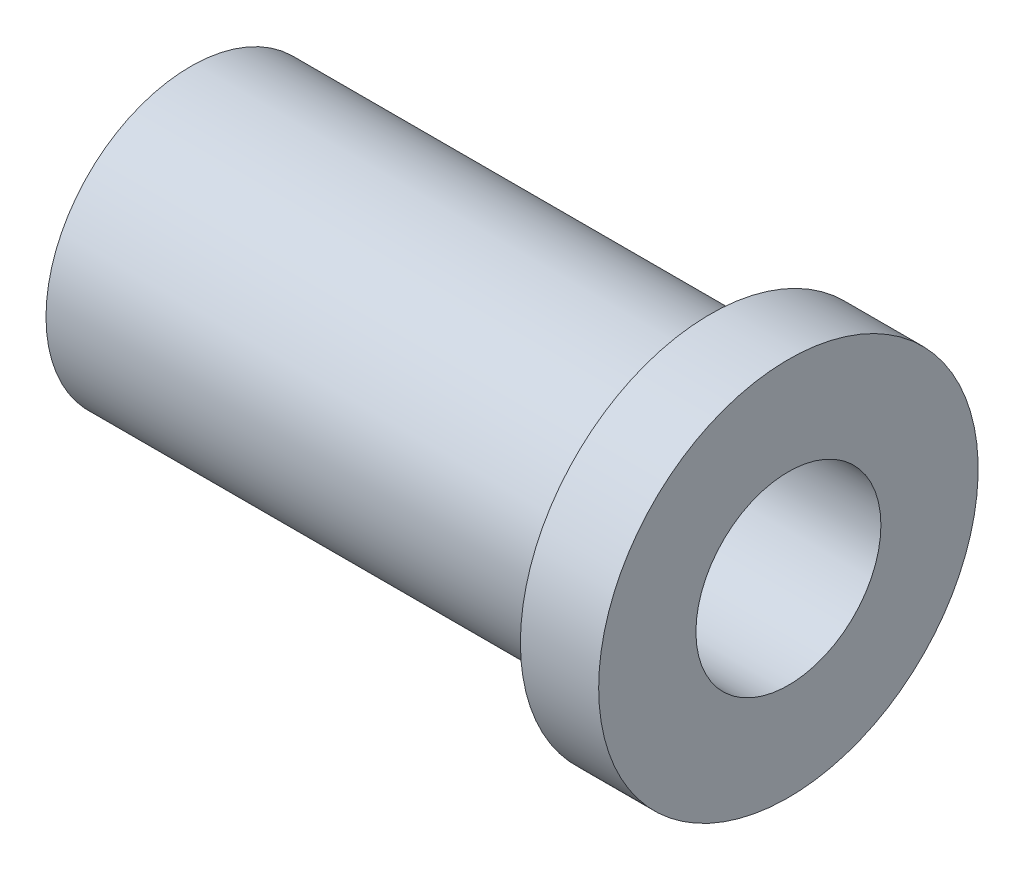
ISO-10303-21;
HEADER;
FILE_DESCRIPTION(('STEP AP214'),'2;1');
FILE_NAME('part.step','',(''),(''),'','','');
FILE_SCHEMA(('AUTOMOTIVE_DESIGN { 1 0 10303 214 1 1 1 1 }'));
ENDSEC;
DATA;
#1=APPLICATION_CONTEXT('core data for automotive mechanical design processes');
#2=APPLICATION_PROTOCOL_DEFINITION('international standard','automotive_design',2000,#1);
#3=PRODUCT_CONTEXT('',#1,'mechanical');
#4=PRODUCT('Part','Part','',(#3));
#5=PRODUCT_RELATED_PRODUCT_CATEGORY('part','',(#4));
#6=PRODUCT_DEFINITION_FORMATION('','',#4);
#7=PRODUCT_DEFINITION_CONTEXT('part definition',#1,'design');
#8=PRODUCT_DEFINITION('design','',#6,#7);
#9=PRODUCT_DEFINITION_SHAPE('','',#8);
#10=(LENGTH_UNIT() NAMED_UNIT(*) SI_UNIT(.MILLI.,.METRE.));
#11=(NAMED_UNIT(*) PLANE_ANGLE_UNIT() SI_UNIT($,.RADIAN.));
#12=(NAMED_UNIT(*) SI_UNIT($,.STERADIAN.) SOLID_ANGLE_UNIT());
#13=UNCERTAINTY_MEASURE_WITH_UNIT(LENGTH_MEASURE(1.E-05),#10,'distance_accuracy_value','');
#14=(GEOMETRIC_REPRESENTATION_CONTEXT(3) GLOBAL_UNCERTAINTY_ASSIGNED_CONTEXT((#13)) GLOBAL_UNIT_ASSIGNED_CONTEXT((#10,
#11,#12)) REPRESENTATION_CONTEXT('',''));
#15=CARTESIAN_POINT('',(0.,0.,0.));
#16=DIRECTION('',(0.,0.,1.));
#17=DIRECTION('',(1.,0.,0.));
#18=AXIS2_PLACEMENT_3D('',#15,#16,#17);
#19=CARTESIAN_POINT('',(-60.4997409092373,0.,0.));
#20=DIRECTION('',(-1.,0.,0.));
#21=DIRECTION('',(0.,0.,1.));
#22=AXIS2_PLACEMENT_3D('',#19,#20,#21);
#23=CYLINDRICAL_SURFACE('',#22,3.9);
#24=CARTESIAN_POINT('',(25.2,0.,0.));
#25=DIRECTION('',(-1.,0.,0.));
#26=DIRECTION('',(0.,0.,1.));
#27=AXIS2_PLACEMENT_3D('',#24,#25,#26);
#28=CIRCLE('',#27,3.9);
#29=CARTESIAN_POINT('',(25.2,0.,3.9));
#30=VERTEX_POINT('',#29);
#31=EDGE_CURVE('E10',#30,#30,#28,.T.);
#32=ORIENTED_EDGE('',*,*,#31,.F.);
#33=EDGE_LOOP('',(#32));
#34=FACE_BOUND('',#33,.T.);
#35=CARTESIAN_POINT('',(0.,0.,0.));
#36=DIRECTION('',(-1.,0.,0.));
#37=DIRECTION('',(0.,0.,1.));
#38=AXIS2_PLACEMENT_3D('',#35,#36,#37);
#39=CIRCLE('',#38,3.9);
#40=CARTESIAN_POINT('',(0.,0.,3.9));
#41=VERTEX_POINT('',#40);
#42=EDGE_CURVE('E64',#41,#41,#39,.T.);
#43=ORIENTED_EDGE('',*,*,#42,.T.);
#44=EDGE_LOOP('',(#43));
#45=FACE_BOUND('',#44,.T.);
#46=ADVANCED_FACE('F39',(#34,#45),#23,.F.);
#47=CARTESIAN_POINT('',(25.2,0.,-8.));
#48=DIRECTION('',(-1.,0.,0.));
#49=DIRECTION('',(0.,0.,1.));
#50=AXIS2_PLACEMENT_3D('',#47,#48,#49);
#51=PLANE('',#50);
#52=CARTESIAN_POINT('',(25.2,0.,0.));
#53=DIRECTION('',(-1.,0.,0.));
#54=DIRECTION('',(0.,0.,1.));
#55=AXIS2_PLACEMENT_3D('',#52,#53,#54);
#56=CIRCLE('',#55,8.);
#57=CARTESIAN_POINT('',(25.2,0.,8.));
#58=VERTEX_POINT('',#57);
#59=EDGE_CURVE('E45',#58,#58,#56,.T.);
#60=ORIENTED_EDGE('',*,*,#59,.F.);
#61=EDGE_LOOP('',(#60));
#62=FACE_BOUND('',#61,.T.);
#63=ORIENTED_EDGE('',*,*,#31,.T.);
#64=EDGE_LOOP('',(#63));
#65=FACE_BOUND('',#64,.T.);
#66=ADVANCED_FACE('F95',(#62,#65),#51,.F.);
#67=CARTESIAN_POINT('',(-60.4997409092373,0.,0.));
#68=DIRECTION('',(-1.,0.,0.));
#69=DIRECTION('',(0.,0.,1.));
#70=AXIS2_PLACEMENT_3D('',#67,#68,#69);
#71=CYLINDRICAL_SURFACE('',#70,8.);
#72=CARTESIAN_POINT('',(21.9,0.,0.));
#73=DIRECTION('',(-1.,0.,0.));
#74=DIRECTION('',(0.,0.,1.));
#75=AXIS2_PLACEMENT_3D('',#72,#73,#74);
#76=CIRCLE('',#75,8.);
#77=CARTESIAN_POINT('',(21.9,0.,8.));
#78=VERTEX_POINT('',#77);
#79=EDGE_CURVE('E49',#78,#78,#76,.T.);
#80=ORIENTED_EDGE('',*,*,#79,.F.);
#81=EDGE_LOOP('',(#80));
#82=FACE_BOUND('',#81,.T.);
#83=ORIENTED_EDGE('',*,*,#59,.T.);
#84=EDGE_LOOP('',(#83));
#85=FACE_BOUND('',#84,.T.);
#86=ADVANCED_FACE('F90',(#82,#85),#71,.T.);
#87=CARTESIAN_POINT('',(21.9,0.,-6.3));
#88=DIRECTION('',(1.,0.,0.));
#89=DIRECTION('',(0.,0.,-1.));
#90=AXIS2_PLACEMENT_3D('',#87,#88,#89);
#91=PLANE('',#90);
#92=CARTESIAN_POINT('',(21.9,0.,0.));
#93=DIRECTION('',(-1.,0.,0.));
#94=DIRECTION('',(0.,0.,1.));
#95=AXIS2_PLACEMENT_3D('',#92,#93,#94);
#96=CIRCLE('',#95,6.3);
#97=CARTESIAN_POINT('',(21.9,0.,6.3));
#98=VERTEX_POINT('',#97);
#99=EDGE_CURVE('E53',#98,#98,#96,.T.);
#100=ORIENTED_EDGE('',*,*,#99,.F.);
#101=EDGE_LOOP('',(#100));
#102=FACE_BOUND('',#101,.T.);
#103=ORIENTED_EDGE('',*,*,#79,.T.);
#104=EDGE_LOOP('',(#103));
#105=FACE_BOUND('',#104,.T.);
#106=ADVANCED_FACE('F84',(#102,#105),#91,.F.);
#107=CARTESIAN_POINT('',(21.7,0.,0.));
#108=DIRECTION('',(-1.,0.,0.));
#109=DIRECTION('',(0.,0.,1.));
#110=AXIS2_PLACEMENT_3D('',#107,#108,#109);
#111=TOROIDAL_SURFACE('',#110,6.3,0.199999999999999);
#112=CARTESIAN_POINT('',(21.7,0.,0.));
#113=DIRECTION('',(-1.,0.,0.));
#114=DIRECTION('',(0.,0.,1.));
#115=AXIS2_PLACEMENT_3D('',#112,#113,#114);
#116=CIRCLE('',#115,6.1);
#117=CARTESIAN_POINT('',(21.7,0.,6.1));
#118=VERTEX_POINT('',#117);
#119=EDGE_CURVE('E58',#118,#118,#116,.T.);
#120=ORIENTED_EDGE('',*,*,#119,.F.);
#121=EDGE_LOOP('',(#120));
#122=FACE_BOUND('',#121,.T.);
#123=ORIENTED_EDGE('',*,*,#99,.T.);
#124=EDGE_LOOP('',(#123));
#125=FACE_BOUND('',#124,.T.);
#126=ADVANCED_FACE('F78',(#122,#125),#111,.F.);
#127=CARTESIAN_POINT('',(-60.4997409092373,0.,0.));
#128=DIRECTION('',(-1.,0.,0.));
#129=DIRECTION('',(0.,0.,1.));
#130=AXIS2_PLACEMENT_3D('',#127,#128,#129);
#131=CYLINDRICAL_SURFACE('',#130,6.1);
#132=CARTESIAN_POINT('',(0.,0.,0.));
#133=DIRECTION('',(-1.,0.,0.));
#134=DIRECTION('',(0.,0.,1.));
#135=AXIS2_PLACEMENT_3D('',#132,#133,#134);
#136=CIRCLE('',#135,6.1);
#137=CARTESIAN_POINT('',(0.,0.,6.1));
#138=VERTEX_POINT('',#137);
#139=EDGE_CURVE('E61',#138,#138,#136,.T.);
#140=ORIENTED_EDGE('',*,*,#139,.F.);
#141=EDGE_LOOP('',(#140));
#142=FACE_BOUND('',#141,.T.);
#143=ORIENTED_EDGE('',*,*,#119,.T.);
#144=EDGE_LOOP('',(#143));
#145=FACE_BOUND('',#144,.T.);
#146=ADVANCED_FACE('F72',(#142,#145),#131,.T.);
#147=CARTESIAN_POINT('',(0.,0.,-3.9));
#148=DIRECTION('',(1.,0.,0.));
#149=DIRECTION('',(0.,0.,-1.));
#150=AXIS2_PLACEMENT_3D('',#147,#148,#149);
#151=PLANE('',#150);
#152=ORIENTED_EDGE('',*,*,#42,.F.);
#153=EDGE_LOOP('',(#152));
#154=FACE_BOUND('',#153,.T.);
#155=ORIENTED_EDGE('',*,*,#139,.T.);
#156=EDGE_LOOP('',(#155));
#157=FACE_BOUND('',#156,.T.);
#158=ADVANCED_FACE('F69',(#154,#157),#151,.F.);
#159=CLOSED_SHELL('',(#46,#66,#86,#106,#126,#146,#158));
#160=MANIFOLD_SOLID_BREP('B2',#159);
#161=ADVANCED_BREP_SHAPE_REPRESENTATION('',(#18,#160),#14);
#162=SHAPE_DEFINITION_REPRESENTATION(#9,#161);
ENDSEC;
END-ISO-10303-21;
